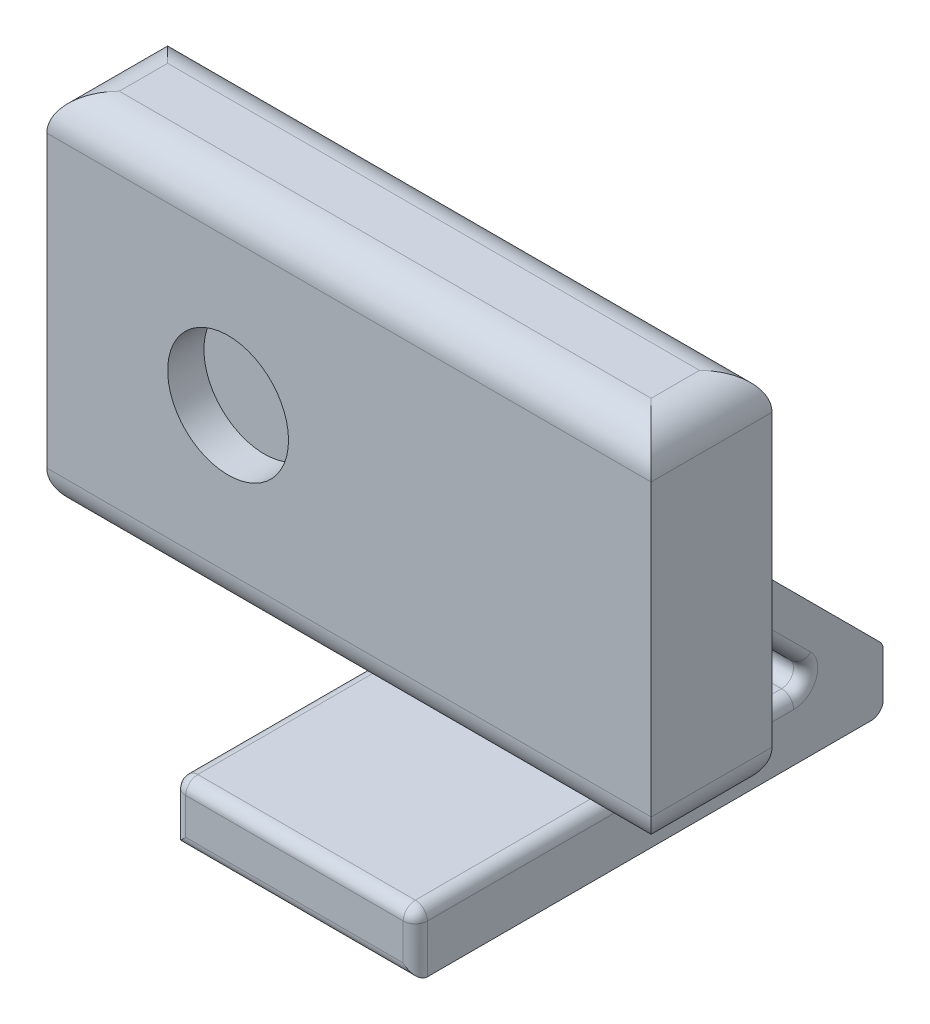
ISO-10303-21;
HEADER;
FILE_DESCRIPTION(('STEP AP214'),'2;1');
FILE_NAME('part.step','',(''),(''),'','','');
FILE_SCHEMA(('AUTOMOTIVE_DESIGN { 1 0 10303 214 1 1 1 1 }'));
ENDSEC;
DATA;
#1=APPLICATION_CONTEXT('core data for automotive mechanical design processes');
#2=APPLICATION_PROTOCOL_DEFINITION('international standard','automotive_design',2000,#1);
#3=PRODUCT_CONTEXT('',#1,'mechanical');
#4=PRODUCT('Part','Part','',(#3));
#5=PRODUCT_RELATED_PRODUCT_CATEGORY('part','',(#4));
#6=PRODUCT_DEFINITION_FORMATION('','',#4);
#7=PRODUCT_DEFINITION_CONTEXT('part definition',#1,'design');
#8=PRODUCT_DEFINITION('design','',#6,#7);
#9=PRODUCT_DEFINITION_SHAPE('','',#8);
#10=(LENGTH_UNIT() NAMED_UNIT(*) SI_UNIT(.MILLI.,.METRE.));
#11=(NAMED_UNIT(*) PLANE_ANGLE_UNIT() SI_UNIT($,.RADIAN.));
#12=(NAMED_UNIT(*) SI_UNIT($,.STERADIAN.) SOLID_ANGLE_UNIT());
#13=UNCERTAINTY_MEASURE_WITH_UNIT(LENGTH_MEASURE(1.E-05),#10,'distance_accuracy_value','');
#14=(GEOMETRIC_REPRESENTATION_CONTEXT(3) GLOBAL_UNCERTAINTY_ASSIGNED_CONTEXT((#13)) GLOBAL_UNIT_ASSIGNED_CONTEXT((#10,
#11,#12)) REPRESENTATION_CONTEXT('',''));
#15=CARTESIAN_POINT('',(0.,0.,0.));
#16=DIRECTION('',(0.,0.,1.));
#17=DIRECTION('',(1.,0.,0.));
#18=AXIS2_PLACEMENT_3D('',#15,#16,#17);
#19=CARTESIAN_POINT('',(25.,15.,10.));
#20=DIRECTION('',(-1.,0.,0.));
#21=DIRECTION('',(0.,-1.,0.));
#22=AXIS2_PLACEMENT_3D('',#19,#20,#21);
#23=PLANE('',#22);
#24=DIRECTION('',(0.,1.,0.));
#25=VECTOR('',#24,1.);
#26=CARTESIAN_POINT('',(25.,15.,10.));
#27=LINE('',#26,#25);
#28=CARTESIAN_POINT('',(25.,-12.,10.));
#29=VERTEX_POINT('',#28);
#30=CARTESIAN_POINT('',(25.,12.,10.));
#31=VERTEX_POINT('',#30);
#32=EDGE_CURVE('E242',#29,#31,#27,.T.);
#33=ORIENTED_EDGE('',*,*,#32,.F.);
#34=DIRECTION('',(0.,0.,-1.));
#35=VECTOR('',#34,1.);
#36=CARTESIAN_POINT('',(25.,-12.,10.));
#37=LINE('',#36,#35);
#38=CARTESIAN_POINT('',(25.,-12.,0.));
#39=VERTEX_POINT('',#38);
#40=EDGE_CURVE('E274',#29,#39,#37,.T.);
#41=ORIENTED_EDGE('',*,*,#40,.T.);
#42=DIRECTION('',(0.,1.,0.));
#43=VECTOR('',#42,1.);
#44=CARTESIAN_POINT('',(25.,15.,0.));
#45=LINE('',#44,#43);
#46=CARTESIAN_POINT('',(25.,12.,0.));
#47=VERTEX_POINT('',#46);
#48=EDGE_CURVE('E241',#39,#47,#45,.T.);
#49=ORIENTED_EDGE('',*,*,#48,.T.);
#50=DIRECTION('',(0.,0.,-1.));
#51=VECTOR('',#50,1.);
#52=CARTESIAN_POINT('',(25.,12.,10.));
#53=LINE('',#52,#51);
#54=EDGE_CURVE('E271',#47,#31,#53,.F.);
#55=ORIENTED_EDGE('',*,*,#54,.T.);
#56=EDGE_LOOP('',(#33,#41,#49,#55));
#57=FACE_BOUND('',#56,.T.);
#58=ADVANCED_FACE('F36',(#57),#23,.F.);
#59=CARTESIAN_POINT('',(-25.,15.,10.));
#60=DIRECTION('',(0.,-1.,0.));
#61=DIRECTION('',(0.,0.,-1.));
#62=AXIS2_PLACEMENT_3D('',#59,#60,#61);
#63=PLANE('',#62);
#64=DIRECTION('',(-1.,0.,0.));
#65=VECTOR('',#64,1.);
#66=CARTESIAN_POINT('',(25.,15.,7.));
#67=LINE('',#66,#65);
#68=CARTESIAN_POINT('',(-22.,15.,7.));
#69=VERTEX_POINT('',#68);
#70=CARTESIAN_POINT('',(22.,15.,7.));
#71=VERTEX_POINT('',#70);
#72=EDGE_CURVE('E284',#69,#71,#67,.F.);
#73=ORIENTED_EDGE('',*,*,#72,.T.);
#74=DIRECTION('',(0.,0.,-1.));
#75=VECTOR('',#74,1.);
#76=CARTESIAN_POINT('',(22.,15.,10.));
#77=LINE('',#76,#75);
#78=CARTESIAN_POINT('',(22.,15.,3.));
#79=VERTEX_POINT('',#78);
#80=EDGE_CURVE('E286',#71,#79,#77,.T.);
#81=ORIENTED_EDGE('',*,*,#80,.T.);
#82=DIRECTION('',(-1.,0.,0.));
#83=VECTOR('',#82,1.);
#84=CARTESIAN_POINT('',(-25.,15.,3.));
#85=LINE('',#84,#83);
#86=CARTESIAN_POINT('',(-22.,15.,3.));
#87=VERTEX_POINT('',#86);
#88=EDGE_CURVE('E280',#79,#87,#85,.T.);
#89=ORIENTED_EDGE('',*,*,#88,.T.);
#90=DIRECTION('',(0.,0.,-1.));
#91=VECTOR('',#90,1.);
#92=CARTESIAN_POINT('',(-22.,15.,10.));
#93=LINE('',#92,#91);
#94=EDGE_CURVE('E282',#87,#69,#93,.F.);
#95=ORIENTED_EDGE('',*,*,#94,.T.);
#96=EDGE_LOOP('',(#73,#81,#89,#95));
#97=FACE_BOUND('',#96,.T.);
#98=ADVANCED_FACE('F468',(#97),#63,.F.);
#99=CARTESIAN_POINT('',(-25.,15.,10.));
#100=DIRECTION('',(1.,0.,0.));
#101=DIRECTION('',(0.,1.,0.));
#102=AXIS2_PLACEMENT_3D('',#99,#100,#101);
#103=PLANE('',#102);
#104=DIRECTION('',(0.,-1.,0.));
#105=VECTOR('',#104,1.);
#106=CARTESIAN_POINT('',(-25.,15.,0.));
#107=LINE('',#106,#105);
#108=CARTESIAN_POINT('',(-25.,12.,0.));
#109=VERTEX_POINT('',#108);
#110=CARTESIAN_POINT('',(-25.,-12.,0.));
#111=VERTEX_POINT('',#110);
#112=EDGE_CURVE('E246',#109,#111,#107,.T.);
#113=ORIENTED_EDGE('',*,*,#112,.T.);
#114=DIRECTION('',(0.,0.,-1.));
#115=VECTOR('',#114,1.);
#116=CARTESIAN_POINT('',(-25.,-12.,10.));
#117=LINE('',#116,#115);
#118=CARTESIAN_POINT('',(-25.,-12.,10.));
#119=VERTEX_POINT('',#118);
#120=EDGE_CURVE('E264',#111,#119,#117,.F.);
#121=ORIENTED_EDGE('',*,*,#120,.T.);
#122=DIRECTION('',(0.,-1.,0.));
#123=VECTOR('',#122,1.);
#124=CARTESIAN_POINT('',(-25.,15.,10.));
#125=LINE('',#124,#123);
#126=CARTESIAN_POINT('',(-25.,12.,10.));
#127=VERTEX_POINT('',#126);
#128=EDGE_CURVE('E245',#127,#119,#125,.T.);
#129=ORIENTED_EDGE('',*,*,#128,.F.);
#130=DIRECTION('',(0.,0.,-1.));
#131=VECTOR('',#130,1.);
#132=CARTESIAN_POINT('',(-25.,12.,10.));
#133=LINE('',#132,#131);
#134=EDGE_CURVE('E262',#127,#109,#133,.T.);
#135=ORIENTED_EDGE('',*,*,#134,.T.);
#136=EDGE_LOOP('',(#113,#121,#129,#135));
#137=FACE_BOUND('',#136,.T.);
#138=ADVANCED_FACE('F453',(#137),#103,.F.);
#139=CARTESIAN_POINT('',(-25.,-15.,10.));
#140=DIRECTION('',(0.,1.,0.));
#141=DIRECTION('',(0.,0.,1.));
#142=AXIS2_PLACEMENT_3D('',#139,#140,#141);
#143=PLANE('',#142);
#144=DIRECTION('',(1.,0.,0.));
#145=VECTOR('',#144,1.);
#146=CARTESIAN_POINT('',(-25.,-15.,7.));
#147=LINE('',#146,#145);
#148=CARTESIAN_POINT('',(22.,-15.,7.));
#149=VERTEX_POINT('',#148);
#150=CARTESIAN_POINT('',(-22.,-15.,7.));
#151=VERTEX_POINT('',#150);
#152=EDGE_CURVE('E257',#149,#151,#147,.F.);
#153=ORIENTED_EDGE('',*,*,#152,.T.);
#154=DIRECTION('',(0.,0.,-1.));
#155=VECTOR('',#154,1.);
#156=CARTESIAN_POINT('',(-22.,-15.,10.));
#157=LINE('',#156,#155);
#158=CARTESIAN_POINT('',(-22.,-15.,3.));
#159=VERTEX_POINT('',#158);
#160=EDGE_CURVE('E259',#151,#159,#157,.T.);
#161=ORIENTED_EDGE('',*,*,#160,.T.);
#162=DIRECTION('',(1.,0.,0.));
#163=VECTOR('',#162,1.);
#164=CARTESIAN_POINT('',(-25.,-15.,3.));
#165=LINE('',#164,#163);
#166=CARTESIAN_POINT('',(22.,-15.,3.));
#167=VERTEX_POINT('',#166);
#168=EDGE_CURVE('E249',#159,#167,#165,.T.);
#169=ORIENTED_EDGE('',*,*,#168,.T.);
#170=DIRECTION('',(0.,0.,-1.));
#171=VECTOR('',#170,1.);
#172=CARTESIAN_POINT('',(22.,-15.,10.));
#173=LINE('',#172,#171);
#174=EDGE_CURVE('E255',#167,#149,#173,.F.);
#175=ORIENTED_EDGE('',*,*,#174,.T.);
#176=EDGE_LOOP('',(#153,#161,#169,#175));
#177=FACE_BOUND('',#176,.T.);
#178=ADVANCED_FACE('F445',(#177),#143,.F.);
#179=CARTESIAN_POINT('',(0.,0.,10.));
#180=DIRECTION('',(0.,0.,1.));
#181=DIRECTION('',(1.,0.,0.));
#182=AXIS2_PLACEMENT_3D('',#179,#180,#181);
#183=PLANE('',#182);
#184=CARTESIAN_POINT('',(-10.,0.,10.));
#185=DIRECTION('',(0.,0.,1.));
#186=DIRECTION('',(1.,0.,0.));
#187=AXIS2_PLACEMENT_3D('',#184,#185,#186);
#188=CIRCLE('',#187,5.);
#189=CARTESIAN_POINT('',(-5.,0.,10.));
#190=VERTEX_POINT('',#189);
#191=EDGE_CURVE('E232',#190,#190,#188,.T.);
#192=ORIENTED_EDGE('',*,*,#191,.F.);
#193=EDGE_LOOP('',(#192));
#194=FACE_BOUND('',#193,.T.);
#195=ORIENTED_EDGE('',*,*,#128,.T.);
#196=DIRECTION('',(1.,0.,0.));
#197=VECTOR('',#196,1.);
#198=CARTESIAN_POINT('',(25.,-12.,10.));
#199=LINE('',#198,#197);
#200=EDGE_CURVE('E269',#119,#29,#199,.T.);
#201=ORIENTED_EDGE('',*,*,#200,.T.);
#202=ORIENTED_EDGE('',*,*,#32,.T.);
#203=DIRECTION('',(-1.,0.,0.));
#204=VECTOR('',#203,1.);
#205=CARTESIAN_POINT('',(-25.,12.,10.));
#206=LINE('',#205,#204);
#207=EDGE_CURVE('E267',#31,#127,#206,.T.);
#208=ORIENTED_EDGE('',*,*,#207,.T.);
#209=EDGE_LOOP('',(#195,#201,#202,#208));
#210=FACE_BOUND('',#209,.T.);
#211=ADVANCED_FACE('F442',(#194,#210),#183,.T.);
#212=CARTESIAN_POINT('',(0.,0.,0.));
#213=DIRECTION('',(0.,0.,1.));
#214=DIRECTION('',(1.,0.,0.));
#215=AXIS2_PLACEMENT_3D('',#212,#213,#214);
#216=PLANE('',#215);
#217=DIRECTION('',(-1.,0.,0.));
#218=VECTOR('',#217,1.);
#219=CARTESIAN_POINT('',(10.,-5.,0.));
#220=LINE('',#219,#218);
#221=CARTESIAN_POINT('',(9.,-5.,0.));
#222=VERTEX_POINT('',#221);
#223=CARTESIAN_POINT('',(-9.,-5.,0.));
#224=VERTEX_POINT('',#223);
#225=EDGE_CURVE('E220',#222,#224,#220,.T.);
#226=ORIENTED_EDGE('',*,*,#225,.F.);
#227=CARTESIAN_POINT('',(9.,-3.5857864376269,0.));
#228=DIRECTION('',(0.,0.,1.));
#229=DIRECTION('',(0.,1.,0.));
#230=AXIS2_PLACEMENT_3D('',#227,#228,#229);
#231=ELLIPSE('',#230,1.4142135623731,1.);
#232=CARTESIAN_POINT('',(10.,-3.5857864376269,0.));
#233=VERTEX_POINT('',#232);
#234=EDGE_CURVE('E45',#222,#233,#231,.T.);
#235=ORIENTED_EDGE('',*,*,#234,.T.);
#236=DIRECTION('',(0.,-1.,0.));
#237=VECTOR('',#236,1.);
#238=CARTESIAN_POINT('',(10.,0.,0.));
#239=LINE('',#238,#237);
#240=CARTESIAN_POINT('',(10.,0.,0.));
#241=VERTEX_POINT('',#240);
#242=EDGE_CURVE('E208',#241,#233,#239,.T.);
#243=ORIENTED_EDGE('',*,*,#242,.F.);
#244=DIRECTION('',(-1.,0.,0.));
#245=VECTOR('',#244,1.);
#246=CARTESIAN_POINT('',(10.,0.,0.));
#247=LINE('',#246,#245);
#248=CARTESIAN_POINT('',(-10.,0.,0.));
#249=VERTEX_POINT('',#248);
#250=EDGE_CURVE('E203',#241,#249,#247,.T.);
#251=ORIENTED_EDGE('',*,*,#250,.T.);
#252=DIRECTION('',(0.,-1.,0.));
#253=VECTOR('',#252,1.);
#254=CARTESIAN_POINT('',(-10.,0.,0.));
#255=LINE('',#254,#253);
#256=CARTESIAN_POINT('',(-10.,-3.5857864376269,0.));
#257=VERTEX_POINT('',#256);
#258=EDGE_CURVE('E217',#249,#257,#255,.T.);
#259=ORIENTED_EDGE('',*,*,#258,.T.);
#260=CARTESIAN_POINT('',(-9.,-3.5857864376269,0.));
#261=DIRECTION('',(0.,0.,1.));
#262=DIRECTION('',(0.,-1.,0.));
#263=AXIS2_PLACEMENT_3D('',#260,#261,#262);
#264=ELLIPSE('',#263,1.4142135623731,1.);
#265=EDGE_CURVE('E11',#257,#224,#264,.T.);
#266=ORIENTED_EDGE('',*,*,#265,.T.);
#267=EDGE_LOOP('',(#226,#235,#243,#251,#259,#266));
#268=FACE_BOUND('',#267,.T.);
#269=ORIENTED_EDGE('',*,*,#48,.F.);
#270=DIRECTION('',(1.,0.,0.));
#271=VECTOR('',#270,1.);
#272=CARTESIAN_POINT('',(0.,-12.,0.));
#273=LINE('',#272,#271);
#274=EDGE_CURVE('E278',#39,#111,#273,.F.);
#275=ORIENTED_EDGE('',*,*,#274,.T.);
#276=ORIENTED_EDGE('',*,*,#112,.F.);
#277=DIRECTION('',(-1.,0.,0.));
#278=VECTOR('',#277,1.);
#279=CARTESIAN_POINT('',(0.,12.,0.));
#280=LINE('',#279,#278);
#281=EDGE_CURVE('E276',#109,#47,#280,.F.);
#282=ORIENTED_EDGE('',*,*,#281,.T.);
#283=EDGE_LOOP('',(#269,#275,#276,#282));
#284=FACE_BOUND('',#283,.T.);
#285=ADVANCED_FACE('F215',(#268,#284),#216,.F.);
#286=CARTESIAN_POINT('',(10.,-5.,0.));
#287=DIRECTION('',(0.,0.707106781186547,-0.707106781186548));
#288=DIRECTION('',(0.,0.707106781186548,0.707106781186547));
#289=AXIS2_PLACEMENT_3D('',#286,#287,#288);
#290=PLANE('',#289);
#291=DIRECTION('',(-1.,0.,0.));
#292=VECTOR('',#291,1.);
#293=CARTESIAN_POINT('',(10.,-22.4940908751583,-17.4940908751583));
#294=LINE('',#293,#292);
#295=CARTESIAN_POINT('',(-9.,-22.4940908751583,-17.4940908751583));
#296=VERTEX_POINT('',#295);
#297=CARTESIAN_POINT('',(9.,-22.4940908751583,-17.4940908751583));
#298=VERTEX_POINT('',#297);
#299=EDGE_CURVE('E320',#296,#298,#294,.F.);
#300=ORIENTED_EDGE('',*,*,#299,.T.);
#301=DIRECTION('',(0.,-0.707106781186548,-0.707106781186547));
#302=VECTOR('',#301,1.);
#303=CARTESIAN_POINT('',(9.,-5.,0.));
#304=LINE('',#303,#302);
#305=EDGE_CURVE('E324',#298,#222,#304,.F.);
#306=ORIENTED_EDGE('',*,*,#305,.T.);
#307=ORIENTED_EDGE('',*,*,#225,.T.);
#308=DIRECTION('',(0.,-0.707106781186548,-0.707106781186547));
#309=VECTOR('',#308,1.);
#310=CARTESIAN_POINT('',(-9.,-5.,0.));
#311=LINE('',#310,#309);
#312=EDGE_CURVE('E322',#224,#296,#311,.T.);
#313=ORIENTED_EDGE('',*,*,#312,.T.);
#314=EDGE_LOOP('',(#300,#306,#307,#313));
#315=FACE_BOUND('',#314,.T.);
#316=ADVANCED_FACE('F533',(#315),#290,.F.);
#317=CARTESIAN_POINT('',(10.,-24.2011976563448,14.5100498540367));
#318=DIRECTION('',(0.,-1.,0.));
#319=DIRECTION('',(0.,0.,-1.));
#320=AXIS2_PLACEMENT_3D('',#317,#318,#319);
#321=PLANE('',#320);
#322=DIRECTION('',(0.,0.,1.));
#323=VECTOR('',#322,1.);
#324=CARTESIAN_POINT('',(9.,-24.2011976563448,-19.2011976563448));
#325=LINE('',#324,#323);
#326=CARTESIAN_POINT('',(9.,-24.2011976563448,13.5100498540367));
#327=VERTEX_POINT('',#326);
#328=CARTESIAN_POINT('',(9.,-24.2011976563448,-16.7869840939717));
#329=VERTEX_POINT('',#328);
#330=EDGE_CURVE('E339',#327,#329,#325,.F.);
#331=ORIENTED_EDGE('',*,*,#330,.T.);
#332=DIRECTION('',(-1.,0.,0.));
#333=VECTOR('',#332,1.);
#334=CARTESIAN_POINT('',(-10.,-24.2011976563448,-16.7869840939717));
#335=LINE('',#334,#333);
#336=CARTESIAN_POINT('',(-9.,-24.2011976563448,-16.7869840939717));
#337=VERTEX_POINT('',#336);
#338=EDGE_CURVE('E341',#329,#337,#335,.T.);
#339=ORIENTED_EDGE('',*,*,#338,.T.);
#340=DIRECTION('',(0.,0.,1.));
#341=VECTOR('',#340,1.);
#342=CARTESIAN_POINT('',(-9.,-24.2011976563448,14.5100498540367));
#343=LINE('',#342,#341);
#344=CARTESIAN_POINT('',(-9.,-24.2011976563448,13.5100498540367));
#345=VERTEX_POINT('',#344);
#346=EDGE_CURVE('E337',#337,#345,#343,.T.);
#347=ORIENTED_EDGE('',*,*,#346,.T.);
#348=DIRECTION('',(-1.,0.,0.));
#349=VECTOR('',#348,1.);
#350=CARTESIAN_POINT('',(10.,-24.2011976563448,13.5100498540367));
#351=LINE('',#350,#349);
#352=EDGE_CURVE('E335',#345,#327,#351,.F.);
#353=ORIENTED_EDGE('',*,*,#352,.T.);
#354=EDGE_LOOP('',(#331,#339,#347,#353));
#355=FACE_BOUND('',#354,.T.);
#356=ADVANCED_FACE('F537',(#355),#321,.F.);
#357=CARTESIAN_POINT('',(10.,-29.2011976563448,14.5100498540367));
#358=DIRECTION('',(0.,0.,-1.));
#359=DIRECTION('',(0.,1.,0.));
#360=AXIS2_PLACEMENT_3D('',#357,#358,#359);
#361=PLANE('',#360);
#362=DIRECTION('',(0.,-1.,0.));
#363=VECTOR('',#362,1.);
#364=CARTESIAN_POINT('',(9.,-24.2011976563448,14.5100498540367));
#365=LINE('',#364,#363);
#366=CARTESIAN_POINT('',(9.,-28.2011976563448,14.5100498540367));
#367=VERTEX_POINT('',#366);
#368=CARTESIAN_POINT('',(9.,-25.2011976563448,14.5100498540367));
#369=VERTEX_POINT('',#368);
#370=EDGE_CURVE('E53',#367,#369,#365,.F.);
#371=ORIENTED_EDGE('',*,*,#370,.T.);
#372=DIRECTION('',(-1.,0.,0.));
#373=VECTOR('',#372,1.);
#374=CARTESIAN_POINT('',(10.,-25.2011976563448,14.5100498540367));
#375=LINE('',#374,#373);
#376=CARTESIAN_POINT('',(-9.,-25.2011976563448,14.5100498540367));
#377=VERTEX_POINT('',#376);
#378=EDGE_CURVE('E348',#369,#377,#375,.T.);
#379=ORIENTED_EDGE('',*,*,#378,.T.);
#380=DIRECTION('',(0.,-1.,0.));
#381=VECTOR('',#380,1.);
#382=CARTESIAN_POINT('',(-9.,-29.2011976563448,14.5100498540367));
#383=LINE('',#382,#381);
#384=CARTESIAN_POINT('',(-9.,-28.2011976563448,14.5100498540367));
#385=VERTEX_POINT('',#384);
#386=EDGE_CURVE('E344',#377,#385,#383,.T.);
#387=ORIENTED_EDGE('',*,*,#386,.T.);
#388=DIRECTION('',(-1.,0.,0.));
#389=VECTOR('',#388,1.);
#390=CARTESIAN_POINT('',(10.,-28.2011976563448,14.5100498540367));
#391=LINE('',#390,#389);
#392=EDGE_CURVE('E58',#385,#367,#391,.F.);
#393=ORIENTED_EDGE('',*,*,#392,.T.);
#394=EDGE_LOOP('',(#371,#379,#387,#393));
#395=FACE_BOUND('',#394,.T.);
#396=ADVANCED_FACE('F541',(#395),#361,.F.);
#397=CARTESIAN_POINT('',(10.,-29.2011976563448,-24.2011976563448));
#398=DIRECTION('',(0.,1.,0.));
#399=DIRECTION('',(0.,0.,1.));
#400=AXIS2_PLACEMENT_3D('',#397,#398,#399);
#401=PLANE('',#400);
#402=DIRECTION('',(0.,0.,-1.));
#403=VECTOR('',#402,1.);
#404=CARTESIAN_POINT('',(10.,-29.2011976563448,-24.2011976563448));
#405=LINE('',#404,#403);
#406=CARTESIAN_POINT('',(10.,-29.2011976563448,13.5100498540367));
#407=VERTEX_POINT('',#406);
#408=CARTESIAN_POINT('',(10.,-29.2011976563448,-23.2011976563448));
#409=VERTEX_POINT('',#408);
#410=EDGE_CURVE('E430',#407,#409,#405,.T.);
#411=ORIENTED_EDGE('',*,*,#410,.F.);
#412=DIRECTION('',(-1.,0.,0.));
#413=VECTOR('',#412,1.);
#414=CARTESIAN_POINT('',(10.,-29.2011976563448,13.5100498540367));
#415=LINE('',#414,#413);
#416=CARTESIAN_POINT('',(-10.,-29.2011976563448,13.5100498540367));
#417=VERTEX_POINT('',#416);
#418=EDGE_CURVE('E352',#407,#417,#415,.T.);
#419=ORIENTED_EDGE('',*,*,#418,.T.);
#420=DIRECTION('',(0.,0.,-1.));
#421=VECTOR('',#420,1.);
#422=CARTESIAN_POINT('',(-10.,-29.2011976563448,-24.2011976563448));
#423=LINE('',#422,#421);
#424=CARTESIAN_POINT('',(-10.,-29.2011976563448,-23.2011976563448));
#425=VERTEX_POINT('',#424);
#426=EDGE_CURVE('E226',#417,#425,#423,.T.);
#427=ORIENTED_EDGE('',*,*,#426,.T.);
#428=DIRECTION('',(-1.,0.,0.));
#429=VECTOR('',#428,1.);
#430=CARTESIAN_POINT('',(10.,-29.2011976563448,-23.2011976563448));
#431=LINE('',#430,#429);
#432=EDGE_CURVE('E350',#425,#409,#431,.F.);
#433=ORIENTED_EDGE('',*,*,#432,.T.);
#434=EDGE_LOOP('',(#411,#419,#427,#433));
#435=FACE_BOUND('',#434,.T.);
#436=ADVANCED_FACE('F419',(#435),#401,.F.);
#437=CARTESIAN_POINT('',(10.,-24.2011976563448,-24.2011976563448));
#438=DIRECTION('',(0.,0.,1.));
#439=DIRECTION('',(1.,0.,0.));
#440=AXIS2_PLACEMENT_3D('',#437,#438,#439);
#441=PLANE('',#440);
#442=DIRECTION('',(0.,1.,0.));
#443=VECTOR('',#442,1.);
#444=CARTESIAN_POINT('',(-10.,-24.2011976563448,-24.2011976563448));
#445=LINE('',#444,#443);
#446=CARTESIAN_POINT('',(-10.,-28.2011976563448,-24.2011976563448));
#447=VERTEX_POINT('',#446);
#448=CARTESIAN_POINT('',(-10.,-24.6154112187179,-24.2011976563448));
#449=VERTEX_POINT('',#448);
#450=EDGE_CURVE('E209',#447,#449,#445,.T.);
#451=ORIENTED_EDGE('',*,*,#450,.T.);
#452=DIRECTION('',(-1.,0.,0.));
#453=VECTOR('',#452,1.);
#454=CARTESIAN_POINT('',(10.,-24.6154112187179,-24.2011976563448));
#455=LINE('',#454,#453);
#456=CARTESIAN_POINT('',(10.,-24.6154112187179,-24.2011976563448));
#457=VERTEX_POINT('',#456);
#458=EDGE_CURVE('E358',#449,#457,#455,.F.);
#459=ORIENTED_EDGE('',*,*,#458,.T.);
#460=DIRECTION('',(0.,1.,0.));
#461=VECTOR('',#460,1.);
#462=CARTESIAN_POINT('',(10.,-24.2011976563448,-24.2011976563448));
#463=LINE('',#462,#461);
#464=CARTESIAN_POINT('',(10.,-28.2011976563448,-24.2011976563448));
#465=VERTEX_POINT('',#464);
#466=EDGE_CURVE('E428',#465,#457,#463,.T.);
#467=ORIENTED_EDGE('',*,*,#466,.F.);
#468=DIRECTION('',(-1.,0.,0.));
#469=VECTOR('',#468,1.);
#470=CARTESIAN_POINT('',(10.,-28.2011976563448,-24.2011976563448));
#471=LINE('',#470,#469);
#472=EDGE_CURVE('E355',#465,#447,#471,.T.);
#473=ORIENTED_EDGE('',*,*,#472,.T.);
#474=EDGE_LOOP('',(#451,#459,#467,#473));
#475=FACE_BOUND('',#474,.T.);
#476=ADVANCED_FACE('F432',(#475),#441,.F.);
#477=CARTESIAN_POINT('',(10.,0.,0.));
#478=DIRECTION('',(0.,-0.707106781186547,0.707106781186548));
#479=DIRECTION('',(0.,-0.707106781186548,-0.707106781186547));
#480=AXIS2_PLACEMENT_3D('',#477,#478,#479);
#481=PLANE('',#480);
#482=DIRECTION('',(0.,0.707106781186548,0.707106781186547));
#483=VECTOR('',#482,1.);
#484=CARTESIAN_POINT('',(10.,0.,0.));
#485=LINE('',#484,#483);
#486=CARTESIAN_POINT('',(10.,-23.9083044375314,-23.9083044375314));
#487=VERTEX_POINT('',#486);
#488=EDGE_CURVE('E221',#487,#241,#485,.T.);
#489=ORIENTED_EDGE('',*,*,#488,.F.);
#490=DIRECTION('',(-1.,0.,0.));
#491=VECTOR('',#490,1.);
#492=CARTESIAN_POINT('',(10.,-23.9083044375314,-23.9083044375314));
#493=LINE('',#492,#491);
#494=CARTESIAN_POINT('',(-10.,-23.9083044375314,-23.9083044375314));
#495=VERTEX_POINT('',#494);
#496=EDGE_CURVE('E205',#487,#495,#493,.T.);
#497=ORIENTED_EDGE('',*,*,#496,.T.);
#498=DIRECTION('',(0.,0.707106781186548,0.707106781186547));
#499=VECTOR('',#498,1.);
#500=CARTESIAN_POINT('',(-10.,0.,0.));
#501=LINE('',#500,#499);
#502=EDGE_CURVE('E199',#495,#249,#501,.T.);
#503=ORIENTED_EDGE('',*,*,#502,.T.);
#504=ORIENTED_EDGE('',*,*,#250,.F.);
#505=EDGE_LOOP('',(#489,#497,#503,#504));
#506=FACE_BOUND('',#505,.T.);
#507=ADVANCED_FACE('F202',(#506),#481,.F.);
#508=CARTESIAN_POINT('',(10.,0.,0.));
#509=DIRECTION('',(1.,0.,0.));
#510=DIRECTION('',(0.,0.,-1.));
#511=AXIS2_PLACEMENT_3D('',#508,#509,#510);
#512=PLANE('',#511);
#513=DIRECTION('',(0.,-0.707106781186548,-0.707106781186547));
#514=VECTOR('',#513,1.);
#515=CARTESIAN_POINT('',(10.,-23.4940908751583,-19.9083044375314));
#516=LINE('',#515,#514);
#517=CARTESIAN_POINT('',(10.,-21.7869840939717,-18.2011976563448));
#518=VERTEX_POINT('',#517);
#519=EDGE_CURVE('E317',#233,#518,#516,.T.);
#520=ORIENTED_EDGE('',*,*,#519,.T.);
#521=CARTESIAN_POINT('',(10.,-23.2011976563448,-16.7869840939717));
#522=DIRECTION('',(1.,0.,0.));
#523=DIRECTION('',(0.,0.,-1.));
#524=AXIS2_PLACEMENT_3D('',#521,#522,#523);
#525=CIRCLE('',#524,2.);
#526=CARTESIAN_POINT('',(10.,-25.2011976563448,-16.7869840939717));
#527=VERTEX_POINT('',#526);
#528=EDGE_CURVE('E360',#518,#527,#525,.F.);
#529=ORIENTED_EDGE('',*,*,#528,.T.);
#530=DIRECTION('',(0.,0.,1.));
#531=VECTOR('',#530,1.);
#532=CARTESIAN_POINT('',(10.,-25.2011976563448,14.5100498540367));
#533=LINE('',#532,#531);
#534=CARTESIAN_POINT('',(10.,-25.2011976563448,13.5100498540367));
#535=VERTEX_POINT('',#534);
#536=EDGE_CURVE('E315',#527,#535,#533,.T.);
#537=ORIENTED_EDGE('',*,*,#536,.T.);
#538=DIRECTION('',(0.,-1.,0.));
#539=VECTOR('',#538,1.);
#540=CARTESIAN_POINT('',(10.,-29.2011976563448,13.5100498540367));
#541=LINE('',#540,#539);
#542=EDGE_CURVE('E313',#535,#407,#541,.T.);
#543=ORIENTED_EDGE('',*,*,#542,.T.);
#544=ORIENTED_EDGE('',*,*,#410,.T.);
#545=CARTESIAN_POINT('',(10.,-28.2011976563448,-23.2011976563448));
#546=DIRECTION('',(1.,0.,0.));
#547=DIRECTION('',(0.,0.,-1.));
#548=AXIS2_PLACEMENT_3D('',#545,#546,#547);
#549=CIRCLE('',#548,1.);
#550=EDGE_CURVE('E289',#409,#465,#549,.T.);
#551=ORIENTED_EDGE('',*,*,#550,.T.);
#552=ORIENTED_EDGE('',*,*,#466,.T.);
#553=CARTESIAN_POINT('',(10.,-24.6154112187179,-23.2011976563448));
#554=DIRECTION('',(1.,0.,0.));
#555=DIRECTION('',(0.,0.,-1.));
#556=AXIS2_PLACEMENT_3D('',#553,#554,#555);
#557=CIRCLE('',#556,1.);
#558=EDGE_CURVE('E311',#457,#487,#557,.T.);
#559=ORIENTED_EDGE('',*,*,#558,.T.);
#560=ORIENTED_EDGE('',*,*,#488,.T.);
#561=ORIENTED_EDGE('',*,*,#242,.T.);
#562=EDGE_LOOP('',(#520,#529,#537,#543,#544,#551,#552,#559,#560,#561));
#563=FACE_BOUND('',#562,.T.);
#564=ADVANCED_FACE('F427',(#563),#512,.T.);
#565=CARTESIAN_POINT('',(-10.,0.,0.));
#566=DIRECTION('',(1.,0.,0.));
#567=DIRECTION('',(0.,0.,-1.));
#568=AXIS2_PLACEMENT_3D('',#565,#566,#567);
#569=PLANE('',#568);
#570=DIRECTION('',(0.,0.,1.));
#571=VECTOR('',#570,1.);
#572=CARTESIAN_POINT('',(-10.,-25.2011976563448,0.));
#573=LINE('',#572,#571);
#574=CARTESIAN_POINT('',(-10.,-25.2011976563448,13.5100498540367));
#575=VERTEX_POINT('',#574);
#576=CARTESIAN_POINT('',(-10.,-25.2011976563448,-16.7869840939717));
#577=VERTEX_POINT('',#576);
#578=EDGE_CURVE('E332',#575,#577,#573,.F.);
#579=ORIENTED_EDGE('',*,*,#578,.T.);
#580=CARTESIAN_POINT('',(-10.,-23.2011976563448,-16.7869840939717));
#581=DIRECTION('',(1.,0.,0.));
#582=DIRECTION('',(0.,0.,-1.));
#583=AXIS2_PLACEMENT_3D('',#580,#581,#582);
#584=CIRCLE('',#583,2.);
#585=CARTESIAN_POINT('',(-10.,-21.7869840939717,-18.2011976563448));
#586=VERTEX_POINT('',#585);
#587=EDGE_CURVE('E362',#577,#586,#584,.T.);
#588=ORIENTED_EDGE('',*,*,#587,.T.);
#589=DIRECTION('',(0.,-0.707106781186548,-0.707106781186547));
#590=VECTOR('',#589,1.);
#591=CARTESIAN_POINT('',(-10.,-1.79289321881345,1.79289321881345));
#592=LINE('',#591,#590);
#593=EDGE_CURVE('E225',#586,#257,#592,.F.);
#594=ORIENTED_EDGE('',*,*,#593,.T.);
#595=ORIENTED_EDGE('',*,*,#258,.F.);
#596=ORIENTED_EDGE('',*,*,#502,.F.);
#597=CARTESIAN_POINT('',(-10.,-24.6154112187179,-23.2011976563448));
#598=DIRECTION('',(1.,0.,0.));
#599=DIRECTION('',(0.,0.,-1.));
#600=AXIS2_PLACEMENT_3D('',#597,#598,#599);
#601=CIRCLE('',#600,1.);
#602=EDGE_CURVE('E328',#495,#449,#601,.F.);
#603=ORIENTED_EDGE('',*,*,#602,.T.);
#604=ORIENTED_EDGE('',*,*,#450,.F.);
#605=CARTESIAN_POINT('',(-10.,-28.2011976563448,-23.2011976563448));
#606=DIRECTION('',(1.,0.,0.));
#607=DIRECTION('',(0.,0.,-1.));
#608=AXIS2_PLACEMENT_3D('',#605,#606,#607);
#609=CIRCLE('',#608,1.);
#610=EDGE_CURVE('E326',#447,#425,#609,.F.);
#611=ORIENTED_EDGE('',*,*,#610,.T.);
#612=ORIENTED_EDGE('',*,*,#426,.F.);
#613=DIRECTION('',(0.,-1.,0.));
#614=VECTOR('',#613,1.);
#615=CARTESIAN_POINT('',(-10.,0.,13.5100498540367));
#616=LINE('',#615,#614);
#617=EDGE_CURVE('E330',#417,#575,#616,.F.);
#618=ORIENTED_EDGE('',*,*,#617,.T.);
#619=EDGE_LOOP('',(#579,#588,#594,#595,#596,#603,#604,#611,#612,#618));
#620=FACE_BOUND('',#619,.T.);
#621=ADVANCED_FACE('F223',(#620),#569,.F.);
#622=CARTESIAN_POINT('',(-10.,0.,7.));
#623=DIRECTION('',(0.,0.,1.));
#624=DIRECTION('',(1.,0.,0.));
#625=AXIS2_PLACEMENT_3D('',#622,#623,#624);
#626=CYLINDRICAL_SURFACE('',#625,5.);
#627=CARTESIAN_POINT('',(-10.,0.,7.));
#628=DIRECTION('',(0.,0.,1.));
#629=DIRECTION('',(1.,0.,0.));
#630=AXIS2_PLACEMENT_3D('',#627,#628,#629);
#631=CIRCLE('',#630,5.);
#632=CARTESIAN_POINT('',(-5.,0.,7.));
#633=VERTEX_POINT('',#632);
#634=EDGE_CURVE('E227',#633,#633,#631,.T.);
#635=ORIENTED_EDGE('',*,*,#634,.F.);
#636=EDGE_LOOP('',(#635));
#637=FACE_BOUND('',#636,.T.);
#638=ORIENTED_EDGE('',*,*,#191,.T.);
#639=EDGE_LOOP('',(#638));
#640=FACE_BOUND('',#639,.T.);
#641=ADVANCED_FACE('F440',(#637,#640),#626,.F.);
#642=CARTESIAN_POINT('',(-10.,0.,7.));
#643=DIRECTION('',(0.,0.,1.));
#644=DIRECTION('',(1.,0.,0.));
#645=AXIS2_PLACEMENT_3D('',#642,#643,#644);
#646=PLANE('',#645);
#647=ORIENTED_EDGE('',*,*,#634,.T.);
#648=EDGE_LOOP('',(#647));
#649=FACE_BOUND('',#648,.T.);
#650=ADVANCED_FACE('F510',(#649),#646,.T.);
#651=CARTESIAN_POINT('',(22.,-12.,10.));
#652=DIRECTION('',(0.,0.,-1.));
#653=DIRECTION('',(-1.,0.,0.));
#654=AXIS2_PLACEMENT_3D('',#651,#652,#653);
#655=CYLINDRICAL_SURFACE('',#654,3.);
#656=CARTESIAN_POINT('',(22.,-12.,3.));
#657=DIRECTION('',(0.707106781186547,0.,0.707106781186547));
#658=DIRECTION('',(0.707106781186547,0.,-0.707106781186547));
#659=AXIS2_PLACEMENT_3D('',#656,#657,#658);
#660=ELLIPSE('',#659,4.24264068711928,3.);
#661=EDGE_CURVE('E295',#39,#167,#660,.F.);
#662=ORIENTED_EDGE('',*,*,#661,.F.);
#663=ORIENTED_EDGE('',*,*,#40,.F.);
#664=CARTESIAN_POINT('',(22.,-12.,7.));
#665=DIRECTION('',(0.707106781186547,0.,-0.707106781186547));
#666=DIRECTION('',(-0.707106781186547,0.,-0.707106781186547));
#667=AXIS2_PLACEMENT_3D('',#664,#665,#666);
#668=ELLIPSE('',#667,4.24264068711928,3.);
#669=EDGE_CURVE('E298',#149,#29,#668,.F.);
#670=ORIENTED_EDGE('',*,*,#669,.F.);
#671=ORIENTED_EDGE('',*,*,#174,.F.);
#672=EDGE_LOOP('',(#662,#663,#670,#671));
#673=FACE_BOUND('',#672,.T.);
#674=ADVANCED_FACE('F507',(#673),#655,.T.);
#675=CARTESIAN_POINT('',(0.,-12.,7.));
#676=DIRECTION('',(-1.,0.,0.));
#677=DIRECTION('',(0.,0.,1.));
#678=AXIS2_PLACEMENT_3D('',#675,#676,#677);
#679=CYLINDRICAL_SURFACE('',#678,3.);
#680=ORIENTED_EDGE('',*,*,#669,.T.);
#681=ORIENTED_EDGE('',*,*,#200,.F.);
#682=CARTESIAN_POINT('',(-22.,-12.,7.));
#683=DIRECTION('',(-0.707106781186547,0.,-0.707106781186547));
#684=DIRECTION('',(-0.707106781186547,0.,0.707106781186547));
#685=AXIS2_PLACEMENT_3D('',#682,#683,#684);
#686=ELLIPSE('',#685,4.24264068711928,3.);
#687=EDGE_CURVE('E292',#151,#119,#686,.T.);
#688=ORIENTED_EDGE('',*,*,#687,.F.);
#689=ORIENTED_EDGE('',*,*,#152,.F.);
#690=EDGE_LOOP('',(#680,#681,#688,#689));
#691=FACE_BOUND('',#690,.T.);
#692=ADVANCED_FACE('F504',(#691),#679,.T.);
#693=CARTESIAN_POINT('',(-25.,-12.,3.));
#694=DIRECTION('',(1.,0.,0.));
#695=DIRECTION('',(0.,0.,-1.));
#696=AXIS2_PLACEMENT_3D('',#693,#694,#695);
#697=CYLINDRICAL_SURFACE('',#696,3.);
#698=ORIENTED_EDGE('',*,*,#661,.T.);
#699=ORIENTED_EDGE('',*,*,#168,.F.);
#700=CARTESIAN_POINT('',(-22.,-12.,3.));
#701=DIRECTION('',(0.707106781186547,0.,-0.707106781186547));
#702=DIRECTION('',(0.707106781186547,0.,0.707106781186547));
#703=AXIS2_PLACEMENT_3D('',#700,#701,#702);
#704=ELLIPSE('',#703,4.24264068711928,3.);
#705=EDGE_CURVE('E290',#111,#159,#704,.F.);
#706=ORIENTED_EDGE('',*,*,#705,.F.);
#707=ORIENTED_EDGE('',*,*,#274,.F.);
#708=EDGE_LOOP('',(#698,#699,#706,#707));
#709=FACE_BOUND('',#708,.T.);
#710=ADVANCED_FACE('F500',(#709),#697,.T.);
#711=CARTESIAN_POINT('',(-22.,-12.,10.));
#712=DIRECTION('',(0.,0.,-1.));
#713=DIRECTION('',(-1.,0.,0.));
#714=AXIS2_PLACEMENT_3D('',#711,#712,#713);
#715=CYLINDRICAL_SURFACE('',#714,3.);
#716=ORIENTED_EDGE('',*,*,#687,.T.);
#717=ORIENTED_EDGE('',*,*,#120,.F.);
#718=ORIENTED_EDGE('',*,*,#705,.T.);
#719=ORIENTED_EDGE('',*,*,#160,.F.);
#720=EDGE_LOOP('',(#716,#717,#718,#719));
#721=FACE_BOUND('',#720,.T.);
#722=ADVANCED_FACE('F497',(#721),#715,.T.);
#723=CARTESIAN_POINT('',(-22.,12.,10.));
#724=DIRECTION('',(0.,0.,-1.));
#725=DIRECTION('',(-1.,0.,0.));
#726=AXIS2_PLACEMENT_3D('',#723,#724,#725);
#727=CYLINDRICAL_SURFACE('',#726,3.);
#728=CARTESIAN_POINT('',(-22.,12.,3.));
#729=DIRECTION('',(-0.707106781186547,0.,0.707106781186547));
#730=DIRECTION('',(-0.707106781186547,0.,-0.707106781186547));
#731=AXIS2_PLACEMENT_3D('',#728,#729,#730);
#732=ELLIPSE('',#731,4.24264068711928,3.);
#733=EDGE_CURVE('E305',#109,#87,#732,.F.);
#734=ORIENTED_EDGE('',*,*,#733,.F.);
#735=ORIENTED_EDGE('',*,*,#134,.F.);
#736=CARTESIAN_POINT('',(-22.,12.,7.));
#737=DIRECTION('',(-0.707106781186547,0.,-0.707106781186547));
#738=DIRECTION('',(0.707106781186547,0.,-0.707106781186547));
#739=AXIS2_PLACEMENT_3D('',#736,#737,#738);
#740=ELLIPSE('',#739,4.24264068711928,3.);
#741=EDGE_CURVE('E293',#69,#127,#740,.F.);
#742=ORIENTED_EDGE('',*,*,#741,.F.);
#743=ORIENTED_EDGE('',*,*,#94,.F.);
#744=EDGE_LOOP('',(#734,#735,#742,#743));
#745=FACE_BOUND('',#744,.T.);
#746=ADVANCED_FACE('F459',(#745),#727,.T.);
#747=CARTESIAN_POINT('',(0.,12.,7.));
#748=DIRECTION('',(1.,0.,0.));
#749=DIRECTION('',(0.,0.,-1.));
#750=AXIS2_PLACEMENT_3D('',#747,#748,#749);
#751=CYLINDRICAL_SURFACE('',#750,3.);
#752=ORIENTED_EDGE('',*,*,#741,.T.);
#753=ORIENTED_EDGE('',*,*,#207,.F.);
#754=CARTESIAN_POINT('',(22.,12.,7.));
#755=DIRECTION('',(0.707106781186547,0.,-0.707106781186547));
#756=DIRECTION('',(0.707106781186547,0.,0.707106781186547));
#757=AXIS2_PLACEMENT_3D('',#754,#755,#756);
#758=ELLIPSE('',#757,4.24264068711928,3.);
#759=EDGE_CURVE('E303',#71,#31,#758,.T.);
#760=ORIENTED_EDGE('',*,*,#759,.F.);
#761=ORIENTED_EDGE('',*,*,#72,.F.);
#762=EDGE_LOOP('',(#752,#753,#760,#761));
#763=FACE_BOUND('',#762,.T.);
#764=ADVANCED_FACE('F464',(#763),#751,.T.);
#765=CARTESIAN_POINT('',(-25.,12.,3.));
#766=DIRECTION('',(-1.,0.,0.));
#767=DIRECTION('',(0.,0.,1.));
#768=AXIS2_PLACEMENT_3D('',#765,#766,#767);
#769=CYLINDRICAL_SURFACE('',#768,3.);
#770=ORIENTED_EDGE('',*,*,#733,.T.);
#771=ORIENTED_EDGE('',*,*,#88,.F.);
#772=CARTESIAN_POINT('',(22.,12.,3.));
#773=DIRECTION('',(-0.707106781186547,0.,-0.707106781186547));
#774=DIRECTION('',(-0.707106781186547,0.,0.707106781186547));
#775=AXIS2_PLACEMENT_3D('',#772,#773,#774);
#776=ELLIPSE('',#775,4.24264068711928,3.);
#777=EDGE_CURVE('E301',#47,#79,#776,.F.);
#778=ORIENTED_EDGE('',*,*,#777,.F.);
#779=ORIENTED_EDGE('',*,*,#281,.F.);
#780=EDGE_LOOP('',(#770,#771,#778,#779));
#781=FACE_BOUND('',#780,.T.);
#782=ADVANCED_FACE('F471',(#781),#769,.T.);
#783=CARTESIAN_POINT('',(22.,12.,10.));
#784=DIRECTION('',(0.,0.,-1.));
#785=DIRECTION('',(-1.,0.,0.));
#786=AXIS2_PLACEMENT_3D('',#783,#784,#785);
#787=CYLINDRICAL_SURFACE('',#786,3.);
#788=ORIENTED_EDGE('',*,*,#759,.T.);
#789=ORIENTED_EDGE('',*,*,#54,.F.);
#790=ORIENTED_EDGE('',*,*,#777,.T.);
#791=ORIENTED_EDGE('',*,*,#80,.F.);
#792=EDGE_LOOP('',(#788,#789,#790,#791));
#793=FACE_BOUND('',#792,.T.);
#794=ADVANCED_FACE('F479',(#793),#787,.T.);
#795=CARTESIAN_POINT('',(-9.,-29.2011976563448,13.5100498540367));
#796=DIRECTION('',(0.,-1.,0.));
#797=DIRECTION('',(0.,0.,-1.));
#798=AXIS2_PLACEMENT_3D('',#795,#796,#797);
#799=CYLINDRICAL_SURFACE('',#798,1.);
#800=CARTESIAN_POINT('',(-9.,-25.2011976563448,13.5100498540367));
#801=DIRECTION('',(0.,1.,0.));
#802=DIRECTION('',(0.,0.,1.));
#803=AXIS2_PLACEMENT_3D('',#800,#801,#802);
#804=CIRCLE('',#803,1.);
#805=EDGE_CURVE('E397',#575,#377,#804,.T.);
#806=ORIENTED_EDGE('',*,*,#805,.F.);
#807=ORIENTED_EDGE('',*,*,#617,.F.);
#808=CARTESIAN_POINT('',(-9.,-28.2011976563448,13.5100498540367));
#809=DIRECTION('',(0.707106781186547,-0.707106781186547,0.));
#810=DIRECTION('',(-0.707106781186547,-0.707106781186547,0.));
#811=AXIS2_PLACEMENT_3D('',#808,#809,#810);
#812=ELLIPSE('',#811,1.41421356237309,1.);
#813=EDGE_CURVE('E40',#385,#417,#812,.T.);
#814=ORIENTED_EDGE('',*,*,#813,.F.);
#815=ORIENTED_EDGE('',*,*,#386,.F.);
#816=EDGE_LOOP('',(#806,#807,#814,#815));
#817=FACE_BOUND('',#816,.T.);
#818=ADVANCED_FACE('F411',(#817),#799,.T.);
#819=CARTESIAN_POINT('',(10.,-28.2011976563448,13.5100498540367));
#820=DIRECTION('',(-1.,0.,0.));
#821=DIRECTION('',(0.,0.,1.));
#822=AXIS2_PLACEMENT_3D('',#819,#820,#821);
#823=CYLINDRICAL_SURFACE('',#822,1.);
#824=ORIENTED_EDGE('',*,*,#813,.T.);
#825=ORIENTED_EDGE('',*,*,#418,.F.);
#826=CARTESIAN_POINT('',(9.,-28.2011976563448,13.5100498540367));
#827=DIRECTION('',(-0.707106781186547,-0.707106781186547,0.));
#828=DIRECTION('',(-0.707106781186547,0.707106781186547,0.));
#829=AXIS2_PLACEMENT_3D('',#826,#827,#828);
#830=ELLIPSE('',#829,1.41421356237309,1.);
#831=EDGE_CURVE('E395',#367,#407,#830,.F.);
#832=ORIENTED_EDGE('',*,*,#831,.F.);
#833=ORIENTED_EDGE('',*,*,#392,.F.);
#834=EDGE_LOOP('',(#824,#825,#832,#833));
#835=FACE_BOUND('',#834,.T.);
#836=ADVANCED_FACE('F408',(#835),#823,.T.);
#837=CARTESIAN_POINT('',(-9.,-25.2011976563448,13.5100498540367));
#838=DIRECTION('',(0.,0.,1.));
#839=DIRECTION('',(1.,0.,0.));
#840=AXIS2_PLACEMENT_3D('',#837,#838,#839);
#841=SPHERICAL_SURFACE('',#840,1.);
#842=CARTESIAN_POINT('',(-9.,-25.2011976563448,13.5100498540367));
#843=DIRECTION('',(0.,0.,1.));
#844=DIRECTION('',(1.,0.,0.));
#845=AXIS2_PLACEMENT_3D('',#842,#843,#844);
#846=CIRCLE('',#845,1.);
#847=EDGE_CURVE('E390',#575,#345,#846,.F.);
#848=ORIENTED_EDGE('',*,*,#847,.F.);
#849=ORIENTED_EDGE('',*,*,#805,.T.);
#850=CARTESIAN_POINT('',(-9.,-25.2011976563448,13.5100498540367));
#851=DIRECTION('',(-1.,0.,0.));
#852=DIRECTION('',(0.,0.,1.));
#853=AXIS2_PLACEMENT_3D('',#850,#851,#852);
#854=CIRCLE('',#853,1.);
#855=EDGE_CURVE('E393',#345,#377,#854,.F.);
#856=ORIENTED_EDGE('',*,*,#855,.F.);
#857=EDGE_LOOP('',(#848,#849,#856));
#858=FACE_BOUND('',#857,.T.);
#859=ADVANCED_FACE('F711',(#858),#841,.T.);
#860=CARTESIAN_POINT('',(9.,0.,13.5100498540367));
#861=DIRECTION('',(0.,1.,0.));
#862=DIRECTION('',(0.,0.,1.));
#863=AXIS2_PLACEMENT_3D('',#860,#861,#862);
#864=CYLINDRICAL_SURFACE('',#863,1.);
#865=ORIENTED_EDGE('',*,*,#831,.T.);
#866=ORIENTED_EDGE('',*,*,#542,.F.);
#867=CARTESIAN_POINT('',(9.,-25.2011976563448,13.5100498540367));
#868=DIRECTION('',(0.,1.,0.));
#869=DIRECTION('',(0.,0.,1.));
#870=AXIS2_PLACEMENT_3D('',#867,#868,#869);
#871=CIRCLE('',#870,1.);
#872=EDGE_CURVE('E387',#369,#535,#871,.T.);
#873=ORIENTED_EDGE('',*,*,#872,.F.);
#874=ORIENTED_EDGE('',*,*,#370,.F.);
#875=EDGE_LOOP('',(#865,#866,#873,#874));
#876=FACE_BOUND('',#875,.T.);
#877=ADVANCED_FACE('F720',(#876),#864,.T.);
#878=CARTESIAN_POINT('',(10.,-25.2011976563448,13.5100498540367));
#879=DIRECTION('',(-1.,0.,0.));
#880=DIRECTION('',(0.,0.,1.));
#881=AXIS2_PLACEMENT_3D('',#878,#879,#880);
#882=CYLINDRICAL_SURFACE('',#881,1.);
#883=ORIENTED_EDGE('',*,*,#855,.T.);
#884=ORIENTED_EDGE('',*,*,#378,.F.);
#885=CARTESIAN_POINT('',(9.,-25.2011976563448,13.5100498540367));
#886=DIRECTION('',(1.,0.,0.));
#887=DIRECTION('',(0.,0.,-1.));
#888=AXIS2_PLACEMENT_3D('',#885,#886,#887);
#889=CIRCLE('',#888,1.);
#890=EDGE_CURVE('E384',#327,#369,#889,.T.);
#891=ORIENTED_EDGE('',*,*,#890,.F.);
#892=ORIENTED_EDGE('',*,*,#352,.F.);
#893=EDGE_LOOP('',(#883,#884,#891,#892));
#894=FACE_BOUND('',#893,.T.);
#895=ADVANCED_FACE('F729',(#894),#882,.T.);
#896=CARTESIAN_POINT('',(-9.,-25.2011976563448,14.5100498540367));
#897=DIRECTION('',(0.,0.,1.));
#898=DIRECTION('',(1.,0.,0.));
#899=AXIS2_PLACEMENT_3D('',#896,#897,#898);
#900=CYLINDRICAL_SURFACE('',#899,1.);
#901=ORIENTED_EDGE('',*,*,#847,.T.);
#902=ORIENTED_EDGE('',*,*,#346,.F.);
#903=CARTESIAN_POINT('',(-9.,-25.2011976563448,-16.7869840939717));
#904=DIRECTION('',(0.,0.,-1.));
#905=DIRECTION('',(-1.,0.,0.));
#906=AXIS2_PLACEMENT_3D('',#903,#904,#905);
#907=CIRCLE('',#906,1.);
#908=EDGE_CURVE('E381',#577,#337,#907,.T.);
#909=ORIENTED_EDGE('',*,*,#908,.F.);
#910=ORIENTED_EDGE('',*,*,#578,.F.);
#911=EDGE_LOOP('',(#901,#902,#909,#910));
#912=FACE_BOUND('',#911,.T.);
#913=ADVANCED_FACE('F739',(#912),#900,.T.);
#914=CARTESIAN_POINT('',(-9.,-4.29289321881345,-0.707106781186548));
#915=DIRECTION('',(0.,-0.707106781186548,-0.707106781186547));
#916=DIRECTION('',(0.,0.707106781186547,-0.707106781186548));
#917=AXIS2_PLACEMENT_3D('',#914,#915,#916);
#918=CYLINDRICAL_SURFACE('',#917,1.);
#919=ORIENTED_EDGE('',*,*,#265,.F.);
#920=ORIENTED_EDGE('',*,*,#593,.F.);
#921=CARTESIAN_POINT('',(-9.,-21.7869840939717,-18.2011976563448));
#922=DIRECTION('',(0.,-0.707106781186548,-0.707106781186548));
#923=DIRECTION('',(0.,0.707106781186548,-0.707106781186548));
#924=AXIS2_PLACEMENT_3D('',#921,#922,#923);
#925=CIRCLE('',#924,1.);
#926=EDGE_CURVE('E378',#296,#586,#925,.T.);
#927=ORIENTED_EDGE('',*,*,#926,.F.);
#928=ORIENTED_EDGE('',*,*,#312,.F.);
#929=EDGE_LOOP('',(#919,#920,#927,#928));
#930=FACE_BOUND('',#929,.T.);
#931=ADVANCED_FACE('F749',(#930),#918,.T.);
#932=CARTESIAN_POINT('',(9.,-25.2011976563448,13.5100498540367));
#933=DIRECTION('',(0.,0.,1.));
#934=DIRECTION('',(1.,0.,0.));
#935=AXIS2_PLACEMENT_3D('',#932,#933,#934);
#936=SPHERICAL_SURFACE('',#935,1.);
#937=ORIENTED_EDGE('',*,*,#890,.T.);
#938=ORIENTED_EDGE('',*,*,#872,.T.);
#939=CARTESIAN_POINT('',(9.,-25.2011976563448,13.5100498540367));
#940=DIRECTION('',(0.,0.,1.));
#941=DIRECTION('',(1.,0.,0.));
#942=AXIS2_PLACEMENT_3D('',#939,#940,#941);
#943=CIRCLE('',#942,1.);
#944=EDGE_CURVE('E375',#327,#535,#943,.F.);
#945=ORIENTED_EDGE('',*,*,#944,.F.);
#946=EDGE_LOOP('',(#937,#938,#945));
#947=FACE_BOUND('',#946,.T.);
#948=ADVANCED_FACE('F759',(#947),#936,.T.);
#949=CARTESIAN_POINT('',(-9.,-23.2011976563448,-16.7869840939717));
#950=DIRECTION('',(1.,0.,0.));
#951=DIRECTION('',(0.,0.,-1.));
#952=AXIS2_PLACEMENT_3D('',#949,#950,#951);
#953=TOROIDAL_SURFACE('',#952,2.,1.);
#954=ORIENTED_EDGE('',*,*,#587,.F.);
#955=ORIENTED_EDGE('',*,*,#908,.T.);
#956=CARTESIAN_POINT('',(-9.,-23.2011976563448,-16.7869840939717));
#957=DIRECTION('',(1.,0.,0.));
#958=DIRECTION('',(0.,0.,-1.));
#959=AXIS2_PLACEMENT_3D('',#956,#957,#958);
#960=CIRCLE('',#959,1.);
#961=EDGE_CURVE('E373',#296,#337,#960,.F.);
#962=ORIENTED_EDGE('',*,*,#961,.F.);
#963=ORIENTED_EDGE('',*,*,#926,.T.);
#964=EDGE_LOOP('',(#954,#955,#962,#963));
#965=FACE_BOUND('',#964,.T.);
#966=ADVANCED_FACE('F769',(#965),#953,.T.);
#967=CARTESIAN_POINT('',(9.,-25.2011976563448,0.));
#968=DIRECTION('',(0.,0.,-1.));
#969=DIRECTION('',(-1.,0.,0.));
#970=AXIS2_PLACEMENT_3D('',#967,#968,#969);
#971=CYLINDRICAL_SURFACE('',#970,1.);
#972=ORIENTED_EDGE('',*,*,#944,.T.);
#973=ORIENTED_EDGE('',*,*,#536,.F.);
#974=CARTESIAN_POINT('',(9.,-25.2011976563448,-16.7869840939717));
#975=DIRECTION('',(0.,0.,-1.));
#976=DIRECTION('',(-1.,0.,0.));
#977=AXIS2_PLACEMENT_3D('',#974,#975,#976);
#978=CIRCLE('',#977,1.);
#979=EDGE_CURVE('E370',#329,#527,#978,.T.);
#980=ORIENTED_EDGE('',*,*,#979,.F.);
#981=ORIENTED_EDGE('',*,*,#330,.F.);
#982=EDGE_LOOP('',(#972,#973,#980,#981));
#983=FACE_BOUND('',#982,.T.);
#984=ADVANCED_FACE('F779',(#983),#971,.T.);
#985=CARTESIAN_POINT('',(10.,-23.2011976563448,-16.7869840939717));
#986=DIRECTION('',(1.,0.,0.));
#987=DIRECTION('',(0.,0.,-1.));
#988=AXIS2_PLACEMENT_3D('',#985,#986,#987);
#989=CYLINDRICAL_SURFACE('',#988,1.);
#990=ORIENTED_EDGE('',*,*,#961,.T.);
#991=ORIENTED_EDGE('',*,*,#338,.F.);
#992=CARTESIAN_POINT('',(9.,-23.2011976563448,-16.7869840939717));
#993=DIRECTION('',(1.,0.,0.));
#994=DIRECTION('',(0.,0.,-1.));
#995=AXIS2_PLACEMENT_3D('',#992,#993,#994);
#996=CIRCLE('',#995,1.);
#997=EDGE_CURVE('E367',#298,#329,#996,.F.);
#998=ORIENTED_EDGE('',*,*,#997,.F.);
#999=ORIENTED_EDGE('',*,*,#299,.F.);
#1000=EDGE_LOOP('',(#990,#991,#998,#999));
#1001=FACE_BOUND('',#1000,.T.);
#1002=ADVANCED_FACE('F789',(#1001),#989,.F.);
#1003=CARTESIAN_POINT('',(9.,-23.2011976563448,-16.7869840939717));
#1004=DIRECTION('',(1.,0.,0.));
#1005=DIRECTION('',(0.,0.,-1.));
#1006=AXIS2_PLACEMENT_3D('',#1003,#1004,#1005);
#1007=TOROIDAL_SURFACE('',#1006,2.,1.);
#1008=ORIENTED_EDGE('',*,*,#979,.T.);
#1009=ORIENTED_EDGE('',*,*,#528,.F.);
#1010=CARTESIAN_POINT('',(9.,-21.7869840939717,-18.2011976563448));
#1011=DIRECTION('',(0.,-0.707106781186547,-0.707106781186547));
#1012=DIRECTION('',(0.,0.707106781186548,-0.707106781186548));
#1013=AXIS2_PLACEMENT_3D('',#1010,#1011,#1012);
#1014=CIRCLE('',#1013,1.);
#1015=EDGE_CURVE('E365',#298,#518,#1014,.F.);
#1016=ORIENTED_EDGE('',*,*,#1015,.F.);
#1017=ORIENTED_EDGE('',*,*,#997,.T.);
#1018=EDGE_LOOP('',(#1008,#1009,#1016,#1017));
#1019=FACE_BOUND('',#1018,.T.);
#1020=ADVANCED_FACE('F799',(#1019),#1007,.T.);
#1021=CARTESIAN_POINT('',(9.,-1.79289321881345,1.79289321881345));
#1022=DIRECTION('',(0.,0.707106781186548,0.707106781186547));
#1023=DIRECTION('',(0.,-0.707106781186547,0.707106781186548));
#1024=AXIS2_PLACEMENT_3D('',#1021,#1022,#1023);
#1025=CYLINDRICAL_SURFACE('',#1024,1.);
#1026=ORIENTED_EDGE('',*,*,#234,.F.);
#1027=ORIENTED_EDGE('',*,*,#305,.F.);
#1028=ORIENTED_EDGE('',*,*,#1015,.T.);
#1029=ORIENTED_EDGE('',*,*,#519,.F.);
#1030=EDGE_LOOP('',(#1026,#1027,#1028,#1029));
#1031=FACE_BOUND('',#1030,.T.);
#1032=ADVANCED_FACE('F809',(#1031),#1025,.T.);
#1033=CARTESIAN_POINT('',(10.,-24.6154112187179,-23.2011976563448));
#1034=DIRECTION('',(-1.,0.,0.));
#1035=DIRECTION('',(0.,0.,1.));
#1036=AXIS2_PLACEMENT_3D('',#1033,#1034,#1035);
#1037=CYLINDRICAL_SURFACE('',#1036,1.);
#1038=ORIENTED_EDGE('',*,*,#558,.F.);
#1039=ORIENTED_EDGE('',*,*,#458,.F.);
#1040=ORIENTED_EDGE('',*,*,#602,.F.);
#1041=ORIENTED_EDGE('',*,*,#496,.F.);
#1042=EDGE_LOOP('',(#1038,#1039,#1040,#1041));
#1043=FACE_BOUND('',#1042,.T.);
#1044=ADVANCED_FACE('F819',(#1043),#1037,.T.);
#1045=CARTESIAN_POINT('',(10.,-28.2011976563448,-23.2011976563448));
#1046=DIRECTION('',(-1.,0.,0.));
#1047=DIRECTION('',(0.,0.,1.));
#1048=AXIS2_PLACEMENT_3D('',#1045,#1046,#1047);
#1049=CYLINDRICAL_SURFACE('',#1048,1.);
#1050=ORIENTED_EDGE('',*,*,#550,.F.);
#1051=ORIENTED_EDGE('',*,*,#432,.F.);
#1052=ORIENTED_EDGE('',*,*,#610,.F.);
#1053=ORIENTED_EDGE('',*,*,#472,.F.);
#1054=EDGE_LOOP('',(#1050,#1051,#1052,#1053));
#1055=FACE_BOUND('',#1054,.T.);
#1056=ADVANCED_FACE('F38',(#1055),#1049,.T.);
#1057=CLOSED_SHELL('',(#58,#98,#138,#178,#211,#285,#316,#356,#396,#436,#476,#507,#564,#621,#641,
#650,#674,#692,#710,#722,#746,#764,#782,#794,#818,#836,#859,#877,#895,#913,#931,#948,#966,#984,
#1002,#1020,#1032,#1044,#1056));
#1058=MANIFOLD_SOLID_BREP('B2',#1057);
#1059=ADVANCED_BREP_SHAPE_REPRESENTATION('',(#18,#1058),#14);
#1060=SHAPE_DEFINITION_REPRESENTATION(#9,#1059);
ENDSEC;
END-ISO-10303-21;
